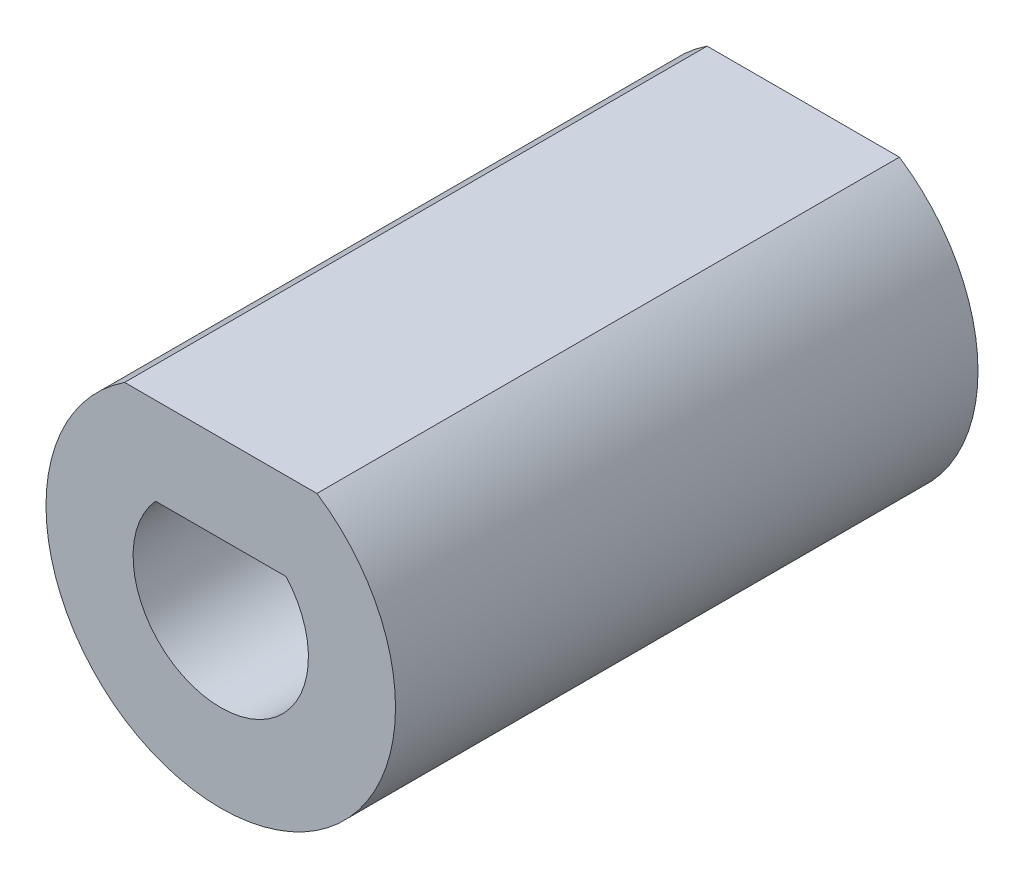
ISO-10303-21;
HEADER;
FILE_DESCRIPTION(('STEP AP214'),'2;1');
FILE_NAME('part.step','',(''),(''),'','','');
FILE_SCHEMA(('AUTOMOTIVE_DESIGN { 1 0 10303 214 1 1 1 1 }'));
ENDSEC;
DATA;
#1=APPLICATION_CONTEXT('core data for automotive mechanical design processes');
#2=APPLICATION_PROTOCOL_DEFINITION('international standard','automotive_design',2000,#1);
#3=PRODUCT_CONTEXT('',#1,'mechanical');
#4=PRODUCT('Part','Part','',(#3));
#5=PRODUCT_RELATED_PRODUCT_CATEGORY('part','',(#4));
#6=PRODUCT_DEFINITION_FORMATION('','',#4);
#7=PRODUCT_DEFINITION_CONTEXT('part definition',#1,'design');
#8=PRODUCT_DEFINITION('design','',#6,#7);
#9=PRODUCT_DEFINITION_SHAPE('','',#8);
#10=(LENGTH_UNIT() NAMED_UNIT(*) SI_UNIT(.MILLI.,.METRE.));
#11=(NAMED_UNIT(*) PLANE_ANGLE_UNIT() SI_UNIT($,.RADIAN.));
#12=(NAMED_UNIT(*) SI_UNIT($,.STERADIAN.) SOLID_ANGLE_UNIT());
#13=UNCERTAINTY_MEASURE_WITH_UNIT(LENGTH_MEASURE(1.E-05),#10,'distance_accuracy_value','');
#14=(GEOMETRIC_REPRESENTATION_CONTEXT(3) GLOBAL_UNCERTAINTY_ASSIGNED_CONTEXT((#13)) GLOBAL_UNIT_ASSIGNED_CONTEXT((#10,
#11,#12)) REPRESENTATION_CONTEXT('',''));
#15=CARTESIAN_POINT('',(0.,0.,0.));
#16=DIRECTION('',(0.,0.,1.));
#17=DIRECTION('',(1.,0.,0.));
#18=AXIS2_PLACEMENT_3D('',#15,#16,#17);
#19=CARTESIAN_POINT('',(0.,0.,10.));
#20=DIRECTION('',(0.,0.,-1.));
#21=DIRECTION('',(-1.,0.,0.));
#22=AXIS2_PLACEMENT_3D('',#19,#20,#21);
#23=CYLINDRICAL_SURFACE('',#22,3.);
#24=CARTESIAN_POINT('',(0.,0.,10.));
#25=DIRECTION('',(0.,0.,1.));
#26=DIRECTION('',(1.,0.,0.));
#27=AXIS2_PLACEMENT_3D('',#24,#25,#26);
#28=CIRCLE('',#27,3.);
#29=CARTESIAN_POINT('',(-1.65074982962289,2.505,10.));
#30=VERTEX_POINT('',#29);
#31=CARTESIAN_POINT('',(1.65074982962289,2.505,10.));
#32=VERTEX_POINT('',#31);
#33=EDGE_CURVE('E11',#30,#32,#28,.T.);
#34=ORIENTED_EDGE('',*,*,#33,.F.);
#35=DIRECTION('',(0.,0.,-1.));
#36=VECTOR('',#35,1.);
#37=CARTESIAN_POINT('',(-1.65074982962289,2.505,10.));
#38=LINE('',#37,#36);
#39=CARTESIAN_POINT('',(-1.65074982962289,2.505,0.));
#40=VERTEX_POINT('',#39);
#41=EDGE_CURVE('E79',#30,#40,#38,.T.);
#42=ORIENTED_EDGE('',*,*,#41,.T.);
#43=CARTESIAN_POINT('',(0.,0.,0.));
#44=DIRECTION('',(0.,0.,1.));
#45=DIRECTION('',(1.,0.,0.));
#46=AXIS2_PLACEMENT_3D('',#43,#44,#45);
#47=CIRCLE('',#46,3.);
#48=CARTESIAN_POINT('',(1.65074982962289,2.505,0.));
#49=VERTEX_POINT('',#48);
#50=EDGE_CURVE('E41',#40,#49,#47,.T.);
#51=ORIENTED_EDGE('',*,*,#50,.T.);
#52=DIRECTION('',(0.,0.,-1.));
#53=VECTOR('',#52,1.);
#54=CARTESIAN_POINT('',(1.65074982962289,2.505,10.));
#55=LINE('',#54,#53);
#56=EDGE_CURVE('E52',#32,#49,#55,.T.);
#57=ORIENTED_EDGE('',*,*,#56,.F.);
#58=EDGE_LOOP('',(#34,#42,#51,#57));
#59=FACE_BOUND('',#58,.T.);
#60=ADVANCED_FACE('F38',(#59),#23,.T.);
#61=CARTESIAN_POINT('',(0.,0.,10.));
#62=DIRECTION('',(0.,0.,1.));
#63=DIRECTION('',(1.,0.,0.));
#64=AXIS2_PLACEMENT_3D('',#61,#62,#63);
#65=PLANE('',#64);
#66=DIRECTION('',(-1.,0.,0.));
#67=VECTOR('',#66,1.);
#68=CARTESIAN_POINT('',(1.65074982962289,2.505,10.));
#69=LINE('',#68,#67);
#70=EDGE_CURVE('E76',#32,#30,#69,.T.);
#71=ORIENTED_EDGE('',*,*,#70,.T.);
#72=ORIENTED_EDGE('',*,*,#33,.T.);
#73=EDGE_LOOP('',(#71,#72));
#74=FACE_BOUND('',#73,.T.);
#75=CARTESIAN_POINT('',(0.,0.,10.));
#76=DIRECTION('',(0.,0.,1.));
#77=DIRECTION('',(1.,0.,0.));
#78=AXIS2_PLACEMENT_3D('',#75,#76,#77);
#79=CIRCLE('',#78,1.505);
#80=CARTESIAN_POINT('',(-1.1202678251204,1.005,10.));
#81=VERTEX_POINT('',#80);
#82=CARTESIAN_POINT('',(1.1202678251204,1.005,10.));
#83=VERTEX_POINT('',#82);
#84=EDGE_CURVE('E60',#81,#83,#79,.T.);
#85=ORIENTED_EDGE('',*,*,#84,.F.);
#86=DIRECTION('',(-1.,0.,0.));
#87=VECTOR('',#86,1.);
#88=CARTESIAN_POINT('',(1.1202678251204,1.005,10.));
#89=LINE('',#88,#87);
#90=EDGE_CURVE('E95',#83,#81,#89,.T.);
#91=ORIENTED_EDGE('',*,*,#90,.F.);
#92=EDGE_LOOP('',(#85,#91));
#93=FACE_BOUND('',#92,.T.);
#94=ADVANCED_FACE('F88',(#74,#93),#65,.T.);
#95=CARTESIAN_POINT('',(0.,0.,0.));
#96=DIRECTION('',(0.,0.,1.));
#97=DIRECTION('',(1.,0.,0.));
#98=AXIS2_PLACEMENT_3D('',#95,#96,#97);
#99=PLANE('',#98);
#100=DIRECTION('',(-1.,0.,0.));
#101=VECTOR('',#100,1.);
#102=CARTESIAN_POINT('',(1.1202678251204,1.005,0.));
#103=LINE('',#102,#101);
#104=CARTESIAN_POINT('',(1.1202678251204,1.005,0.));
#105=VERTEX_POINT('',#104);
#106=CARTESIAN_POINT('',(-1.1202678251204,1.005,0.));
#107=VERTEX_POINT('',#106);
#108=EDGE_CURVE('E101',#105,#107,#103,.T.);
#109=ORIENTED_EDGE('',*,*,#108,.T.);
#110=CARTESIAN_POINT('',(0.,0.,0.));
#111=DIRECTION('',(0.,0.,1.));
#112=DIRECTION('',(1.,0.,0.));
#113=AXIS2_PLACEMENT_3D('',#110,#111,#112);
#114=CIRCLE('',#113,1.505);
#115=EDGE_CURVE('E97',#107,#105,#114,.T.);
#116=ORIENTED_EDGE('',*,*,#115,.T.);
#117=EDGE_LOOP('',(#109,#116));
#118=FACE_BOUND('',#117,.T.);
#119=ORIENTED_EDGE('',*,*,#50,.F.);
#120=DIRECTION('',(-1.,0.,0.));
#121=VECTOR('',#120,1.);
#122=CARTESIAN_POINT('',(1.65074982962289,2.505,0.));
#123=LINE('',#122,#121);
#124=EDGE_CURVE('E82',#49,#40,#123,.T.);
#125=ORIENTED_EDGE('',*,*,#124,.F.);
#126=EDGE_LOOP('',(#119,#125));
#127=FACE_BOUND('',#126,.T.);
#128=ADVANCED_FACE('F91',(#118,#127),#99,.F.);
#129=CARTESIAN_POINT('',(0.,0.,0.));
#130=DIRECTION('',(0.,0.,1.));
#131=DIRECTION('',(1.,0.,0.));
#132=AXIS2_PLACEMENT_3D('',#129,#130,#131);
#133=CYLINDRICAL_SURFACE('',#132,1.505);
#134=ORIENTED_EDGE('',*,*,#84,.T.);
#135=DIRECTION('',(0.,0.,1.));
#136=VECTOR('',#135,1.);
#137=CARTESIAN_POINT('',(1.1202678251204,1.005,0.));
#138=LINE('',#137,#136);
#139=EDGE_CURVE('E106',#105,#83,#138,.T.);
#140=ORIENTED_EDGE('',*,*,#139,.F.);
#141=ORIENTED_EDGE('',*,*,#115,.F.);
#142=DIRECTION('',(0.,0.,1.));
#143=VECTOR('',#142,1.);
#144=CARTESIAN_POINT('',(-1.1202678251204,1.005,0.));
#145=LINE('',#144,#143);
#146=EDGE_CURVE('E104',#107,#81,#145,.T.);
#147=ORIENTED_EDGE('',*,*,#146,.T.);
#148=EDGE_LOOP('',(#134,#140,#141,#147));
#149=FACE_BOUND('',#148,.T.);
#150=ADVANCED_FACE('F115',(#149),#133,.F.);
#151=CARTESIAN_POINT('',(1.1202678251204,1.005,0.));
#152=DIRECTION('',(0.,1.,0.));
#153=DIRECTION('',(0.,0.,1.));
#154=AXIS2_PLACEMENT_3D('',#151,#152,#153);
#155=PLANE('',#154);
#156=ORIENTED_EDGE('',*,*,#90,.T.);
#157=ORIENTED_EDGE('',*,*,#146,.F.);
#158=ORIENTED_EDGE('',*,*,#108,.F.);
#159=ORIENTED_EDGE('',*,*,#139,.T.);
#160=EDGE_LOOP('',(#156,#157,#158,#159));
#161=FACE_BOUND('',#160,.T.);
#162=ADVANCED_FACE('F119',(#161),#155,.F.);
#163=CARTESIAN_POINT('',(1.65074982962289,2.505,10.));
#164=DIRECTION('',(0.,-1.,0.));
#165=DIRECTION('',(0.,0.,-1.));
#166=AXIS2_PLACEMENT_3D('',#163,#164,#165);
#167=PLANE('',#166);
#168=ORIENTED_EDGE('',*,*,#124,.T.);
#169=ORIENTED_EDGE('',*,*,#41,.F.);
#170=ORIENTED_EDGE('',*,*,#70,.F.);
#171=ORIENTED_EDGE('',*,*,#56,.T.);
#172=EDGE_LOOP('',(#168,#169,#170,#171));
#173=FACE_BOUND('',#172,.T.);
#174=ADVANCED_FACE('F77',(#173),#167,.F.);
#175=CLOSED_SHELL('',(#60,#94,#128,#150,#162,#174));
#176=MANIFOLD_SOLID_BREP('B2',#175);
#177=ADVANCED_BREP_SHAPE_REPRESENTATION('',(#18,#176),#14);
#178=SHAPE_DEFINITION_REPRESENTATION(#9,#177);
ENDSEC;
END-ISO-10303-21;
